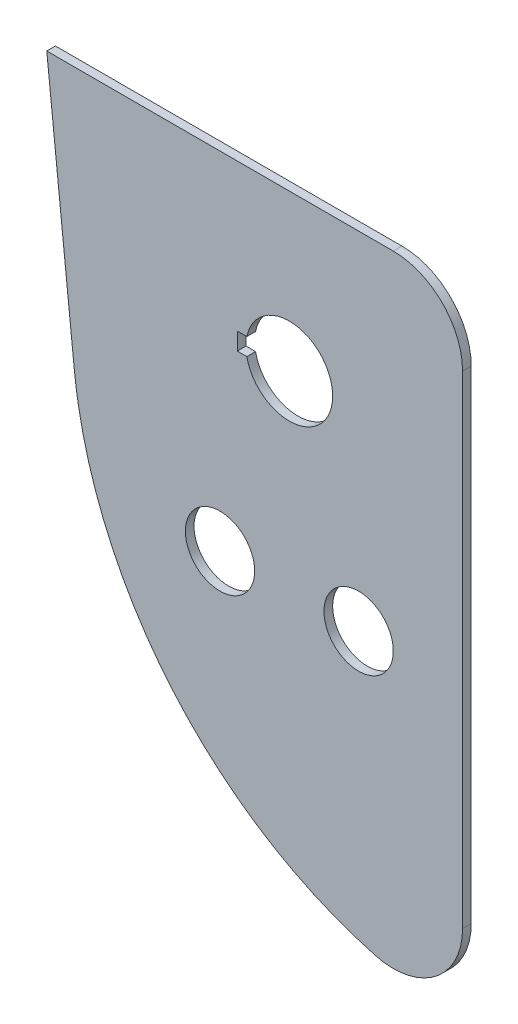
ISO-10303-21;
HEADER;
FILE_DESCRIPTION(('STEP AP214'),'2;1');
FILE_NAME('part.step','',(''),(''),'','','');
FILE_SCHEMA(('AUTOMOTIVE_DESIGN { 1 0 10303 214 1 1 1 1 }'));
ENDSEC;
DATA;
#1=APPLICATION_CONTEXT('core data for automotive mechanical design processes');
#2=APPLICATION_PROTOCOL_DEFINITION('international standard','automotive_design',2000,#1);
#3=PRODUCT_CONTEXT('',#1,'mechanical');
#4=PRODUCT('Part','Part','',(#3));
#5=PRODUCT_RELATED_PRODUCT_CATEGORY('part','',(#4));
#6=PRODUCT_DEFINITION_FORMATION('','',#4);
#7=PRODUCT_DEFINITION_CONTEXT('part definition',#1,'design');
#8=PRODUCT_DEFINITION('design','',#6,#7);
#9=PRODUCT_DEFINITION_SHAPE('','',#8);
#10=(LENGTH_UNIT() NAMED_UNIT(*) SI_UNIT(.MILLI.,.METRE.));
#11=(NAMED_UNIT(*) PLANE_ANGLE_UNIT() SI_UNIT($,.RADIAN.));
#12=(NAMED_UNIT(*) SI_UNIT($,.STERADIAN.) SOLID_ANGLE_UNIT());
#13=UNCERTAINTY_MEASURE_WITH_UNIT(LENGTH_MEASURE(1.E-05),#10,'distance_accuracy_value','');
#14=(GEOMETRIC_REPRESENTATION_CONTEXT(3) GLOBAL_UNCERTAINTY_ASSIGNED_CONTEXT((#13)) GLOBAL_UNIT_ASSIGNED_CONTEXT((#10,
#11,#12)) REPRESENTATION_CONTEXT('',''));
#15=CARTESIAN_POINT('',(0.,0.,0.));
#16=DIRECTION('',(0.,0.,1.));
#17=DIRECTION('',(1.,0.,0.));
#18=AXIS2_PLACEMENT_3D('',#15,#16,#17);
#19=CARTESIAN_POINT('',(-56.3280252004743,-154.902468876858,1.5875));
#20=CARTESIAN_POINT('',(-56.3464760441755,-154.899600353284,1.5875));
#21=CARTESIAN_POINT('',(-56.4028845170588,-154.89083061696,1.5875));
#22=CARTESIAN_POINT('',(-56.6110800326477,-154.858170111136,1.5875));
#23=CARTESIAN_POINT('',(-57.1041364240119,-154.778892219976,1.5875));
#24=CARTESIAN_POINT('',(-58.0508965766844,-154.617474355913,1.5875));
#25=CARTESIAN_POINT('',(-60.3544148529312,-154.185740423432,1.5875));
#26=CARTESIAN_POINT('',(-63.3889382662356,-153.485638356869,1.5875));
#27=CARTESIAN_POINT('',(-67.0109511921925,-152.444549796343,1.5875));
#28=CARTESIAN_POINT('',(-70.2190860634272,-151.362943175937,1.5875));
#29=CARTESIAN_POINT('',(-73.4463699671487,-150.103845865602,1.5875));
#30=CARTESIAN_POINT('',(-76.6129961365469,-148.694555997917,1.5875));
#31=CARTESIAN_POINT('',(-79.7122168788951,-147.138105291344,1.5875));
#32=CARTESIAN_POINT('',(-82.7374334194048,-145.437839357075,1.5875));
#33=CARTESIAN_POINT('',(-85.6822091427996,-143.597409415367,1.5875));
#34=CARTESIAN_POINT('',(-88.540283437849,-141.620764011248,1.5875));
#35=CARTESIAN_POINT('',(-91.3055845564438,-139.512139867612,1.5875));
#36=CARTESIAN_POINT('',(-93.9722422228184,-137.276052335977,1.5875));
#37=CARTESIAN_POINT('',(-96.5345996281736,-134.917285272487,1.5875));
#38=CARTESIAN_POINT('',(-98.9872249716935,-132.440880464169,1.5875));
#39=CARTESIAN_POINT('',(-101.324922461342,-129.852126584677,1.5875));
#40=CARTESIAN_POINT('',(-103.542742806029,-127.156547724619,1.5875));
#41=CARTESIAN_POINT('',(-105.635993174521,-124.359891507091,1.5875));
#42=CARTESIAN_POINT('',(-107.600246622216,-121.468116812763,1.5875));
#43=CARTESIAN_POINT('',(-109.431350973334,-118.487381131183,1.5875));
#44=CARTESIAN_POINT('',(-111.125437150822,-115.424027556797,1.5875));
#45=CARTESIAN_POINT('',(-112.678926942331,-112.284571447923,1.5875));
#46=CARTESIAN_POINT('',(-114.088540190762,-109.075686767198,1.5875));
#47=CARTESIAN_POINT('',(-115.351301396418,-105.804192123372,1.5875));
#48=CARTESIAN_POINT('',(-116.464545717766,-102.477036535094,1.5875));
#49=CARTESIAN_POINT('',(-117.425924356969,-99.1012849394545,1.5875));
#50=CARTESIAN_POINT('',(-118.23340931716,-95.6841034690706,1.5875));
#51=CARTESIAN_POINT('',(-118.885297518413,-92.2327445241503,1.5875));
#52=CARTESIAN_POINT('',(-119.242744402289,-89.7206525997072,1.5875));
#53=CARTESIAN_POINT('',(-119.408317308655,-88.2860300117571,1.5875));
#54=CARTESIAN_POINT('',(-119.442476963168,-87.9756583155358,1.5875));
#55=CARTESIAN_POINT('',(-119.459203349528,-87.8204331553983,1.5875));
#56=CARTESIAN_POINT('',(-119.468609127792,-87.7319314990573,1.5875));
#57=CARTESIAN_POINT('',(-119.473836088837,-87.6822365191554,1.5875));
#58=CARTESIAN_POINT('',(-119.47498022809,-87.6713586923019,1.5875));
#59=B_SPLINE_CURVE_WITH_KNOTS('',3,(#19,#20,#21,#22,#23,#24,#25,#26,#27,#28,#29,#30,#31,#32,#33,
#34,#35,#36,#37,#38,#39,#40,#41,#42,#43,#44,#45,#46,#47,#48,#49,#50,#51,#52,#53,#54,#55,#56,#57,
#58),.UNSPECIFIED.,.F.,.F.,(4,1,1,1,1,1,1,1,1,1,1,1,1,1,1,1,1,1,1,1,1,1,1,1,1,1,1,1,1,1,1,1,1,1,
1,1,1,4),(0.,0.00057063359885489,0.00174455815726337,0.0064402321787929,0.0158314421469551,
0.0310917362589596,0.0780426670362885,0.110904268377742,0.146108785012946,0.181308268021453,
0.216502218693789,0.251690199044468,0.286871835073774,0.322046819020926,0.357214910625147,
0.392375937451137,0.427529794347504,0.462676442119212,0.4978159055245,0.532948270670759,
0.568073681941952,0.603192338553654,0.6383044908169,0.673410436233386,0.70851051547869,
0.743605108360448,0.778694629809107,0.813779525945953,0.848860270263026,0.883937359954929,
0.919011312390278,0.954082661746279,0.989151955788736,0.994996677379927,0.99733455495218,
0.998503491450853,0.999672426452037,1.),.UNSPECIFIED.);
#60=DIRECTION('',(0.,0.,-1.));
#61=VECTOR('',#60,1.);
#62=SURFACE_OF_LINEAR_EXTRUSION('',#59,#61);
#63=CARTESIAN_POINT('',(-56.3280252004743,-154.902468876858,0.));
#64=CARTESIAN_POINT('',(-56.3464760441755,-154.899600353284,0.));
#65=CARTESIAN_POINT('',(-56.4028845170588,-154.89083061696,0.));
#66=CARTESIAN_POINT('',(-56.6110800326477,-154.858170111136,0.));
#67=CARTESIAN_POINT('',(-57.1041364240119,-154.778892219976,0.));
#68=CARTESIAN_POINT('',(-58.0508965766844,-154.617474355913,0.));
#69=CARTESIAN_POINT('',(-60.3544148529312,-154.185740423432,0.));
#70=CARTESIAN_POINT('',(-63.3889382662356,-153.485638356869,0.));
#71=CARTESIAN_POINT('',(-67.0109511921925,-152.444549796343,0.));
#72=CARTESIAN_POINT('',(-70.2190860634272,-151.362943175937,0.));
#73=CARTESIAN_POINT('',(-73.4463699671487,-150.103845865602,0.));
#74=CARTESIAN_POINT('',(-76.6129961365469,-148.694555997917,0.));
#75=CARTESIAN_POINT('',(-79.7122168788951,-147.138105291344,0.));
#76=CARTESIAN_POINT('',(-82.7374334194048,-145.437839357075,0.));
#77=CARTESIAN_POINT('',(-85.6822091427996,-143.597409415367,0.));
#78=CARTESIAN_POINT('',(-88.540283437849,-141.620764011248,0.));
#79=CARTESIAN_POINT('',(-91.3055845564438,-139.512139867612,0.));
#80=CARTESIAN_POINT('',(-93.9722422228184,-137.276052335977,0.));
#81=CARTESIAN_POINT('',(-96.5345996281736,-134.917285272487,0.));
#82=CARTESIAN_POINT('',(-98.9872249716935,-132.440880464169,0.));
#83=CARTESIAN_POINT('',(-101.324922461342,-129.852126584677,0.));
#84=CARTESIAN_POINT('',(-103.542742806029,-127.156547724619,0.));
#85=CARTESIAN_POINT('',(-105.635993174521,-124.359891507091,0.));
#86=CARTESIAN_POINT('',(-107.600246622216,-121.468116812763,0.));
#87=CARTESIAN_POINT('',(-109.431350973334,-118.487381131183,0.));
#88=CARTESIAN_POINT('',(-111.125437150822,-115.424027556797,0.));
#89=CARTESIAN_POINT('',(-112.678926942331,-112.284571447923,0.));
#90=CARTESIAN_POINT('',(-114.088540190762,-109.075686767198,0.));
#91=CARTESIAN_POINT('',(-115.351301396418,-105.804192123372,0.));
#92=CARTESIAN_POINT('',(-116.464545717766,-102.477036535094,0.));
#93=CARTESIAN_POINT('',(-117.425924356969,-99.1012849394545,0.));
#94=CARTESIAN_POINT('',(-118.23340931716,-95.6841034690706,0.));
#95=CARTESIAN_POINT('',(-118.885297518413,-92.2327445241503,0.));
#96=CARTESIAN_POINT('',(-119.242744402289,-89.7206525997072,0.));
#97=CARTESIAN_POINT('',(-119.408317308655,-88.2860300117571,0.));
#98=CARTESIAN_POINT('',(-119.442476963168,-87.9756583155358,0.));
#99=CARTESIAN_POINT('',(-119.459203349528,-87.8204331553983,0.));
#100=CARTESIAN_POINT('',(-119.468609127792,-87.7319314990573,0.));
#101=CARTESIAN_POINT('',(-119.473836088837,-87.6822365191554,0.));
#102=CARTESIAN_POINT('',(-119.47498022809,-87.6713586923019,0.));
#103=B_SPLINE_CURVE_WITH_KNOTS('',3,(#63,#64,#65,#66,#67,#68,#69,#70,#71,#72,#73,#74,#75,#76,
#77,#78,#79,#80,#81,#82,#83,#84,#85,#86,#87,#88,#89,#90,#91,#92,#93,#94,#95,#96,#97,#98,#99,
#100,#101,#102),.UNSPECIFIED.,.F.,.F.,(4,1,1,1,1,1,1,1,1,1,1,1,1,1,1,1,1,1,1,1,1,1,1,1,1,1,1,1,
1,1,1,1,1,1,1,1,1,4),(0.,0.00057063359885489,0.00174455815726337,0.0064402321787929,
0.0158314421469551,0.0310917362589596,0.0780426670362885,0.110904268377742,0.146108785012946,
0.181308268021453,0.216502218693789,0.251690199044468,0.286871835073774,0.322046819020926,
0.357214910625147,0.392375937451137,0.427529794347504,0.462676442119212,0.4978159055245,
0.532948270670759,0.568073681941952,0.603192338553654,0.6383044908169,0.673410436233386,
0.70851051547869,0.743605108360448,0.778694629809107,0.813779525945953,0.848860270263026,
0.883937359954929,0.919011312390278,0.954082661746279,0.989151955788736,0.994996677379927,
0.99733455495218,0.998503491450853,0.999672426452037,1.),.UNSPECIFIED.);
#104=CARTESIAN_POINT('',(-64.3348091368523,-153.199286445926,0.));
#105=VERTEX_POINT('',#104);
#106=CARTESIAN_POINT('',(-119.474980228086,-87.6713586923396,0.));
#107=VERTEX_POINT('',#106);
#108=EDGE_CURVE('E164',#105,#107,#103,.T.);
#109=ORIENTED_EDGE('',*,*,#108,.F.);
#110=DIRECTION('',(0.,0.,-1.));
#111=VECTOR('',#110,1.);
#112=CARTESIAN_POINT('',(-64.3348091368523,-153.199286445926,0.));
#113=LINE('',#112,#111);
#114=CARTESIAN_POINT('',(-64.3348091368523,-153.199286445926,1.5875));
#115=VERTEX_POINT('',#114);
#116=EDGE_CURVE('E11',#105,#115,#113,.F.);
#117=ORIENTED_EDGE('',*,*,#116,.T.);
#118=CARTESIAN_POINT('',(-119.474980228086,-87.6713586923396,1.5875));
#119=VERTEX_POINT('',#118);
#120=EDGE_CURVE('E169',#115,#119,#59,.T.);
#121=ORIENTED_EDGE('',*,*,#120,.T.);
#122=DIRECTION('',(0.,0.,-1.));
#123=VECTOR('',#122,1.);
#124=CARTESIAN_POINT('',(-119.474980228086,-87.6713586923396,1.5875));
#125=LINE('',#124,#123);
#126=EDGE_CURVE('E216',#119,#107,#125,.T.);
#127=ORIENTED_EDGE('',*,*,#126,.T.);
#128=EDGE_LOOP('',(#109,#117,#121,#127));
#129=FACE_BOUND('',#128,.T.);
#130=ADVANCED_FACE('F37',(#129),#62,.T.);
#131=CARTESIAN_POINT('',(-48.3068492831472,0.,1.5875));
#132=DIRECTION('',(-1.,0.,0.));
#133=DIRECTION('',(0.,0.,1.));
#134=AXIS2_PLACEMENT_3D('',#131,#132,#133);
#135=PLANE('',#134);
#136=DIRECTION('',(0.,1.,0.));
#137=VECTOR('',#136,1.);
#138=CARTESIAN_POINT('',(-48.3068492831472,0.,0.));
#139=LINE('',#138,#137);
#140=CARTESIAN_POINT('',(-48.3068492831472,-140.943076460285,0.));
#141=VERTEX_POINT('',#140);
#142=CARTESIAN_POINT('',(-48.3068492831472,-52.4702315071248,0.));
#143=VERTEX_POINT('',#142);
#144=EDGE_CURVE('E225',#141,#143,#139,.T.);
#145=ORIENTED_EDGE('',*,*,#144,.T.);
#146=DIRECTION('',(0.,0.,-1.));
#147=VECTOR('',#146,1.);
#148=CARTESIAN_POINT('',(-48.3068492831472,-52.4702315071248,1.5875));
#149=LINE('',#148,#147);
#150=CARTESIAN_POINT('',(-48.3068492831472,-52.4702315071248,1.5875));
#151=VERTEX_POINT('',#150);
#152=EDGE_CURVE('E58',#143,#151,#149,.F.);
#153=ORIENTED_EDGE('',*,*,#152,.T.);
#154=DIRECTION('',(0.,1.,0.));
#155=VECTOR('',#154,1.);
#156=CARTESIAN_POINT('',(-48.3068492831472,0.,1.5875));
#157=LINE('',#156,#155);
#158=CARTESIAN_POINT('',(-48.3068492831472,-140.943076460285,1.5875));
#159=VERTEX_POINT('',#158);
#160=EDGE_CURVE('E174',#159,#151,#157,.T.);
#161=ORIENTED_EDGE('',*,*,#160,.F.);
#162=DIRECTION('',(0.,0.,1.));
#163=VECTOR('',#162,1.);
#164=CARTESIAN_POINT('',(-48.3068492831472,-140.943076460285,0.));
#165=LINE('',#164,#163);
#166=EDGE_CURVE('E206',#159,#141,#165,.F.);
#167=ORIENTED_EDGE('',*,*,#166,.T.);
#168=EDGE_LOOP('',(#145,#153,#161,#167));
#169=FACE_BOUND('',#168,.T.);
#170=ADVANCED_FACE('F183',(#169),#135,.F.);
#171=CARTESIAN_POINT('',(0.,-39.7702315071249,1.5875));
#172=DIRECTION('',(0.,1.,0.));
#173=DIRECTION('',(-1.,0.,0.));
#174=AXIS2_PLACEMENT_3D('',#171,#172,#173);
#175=PLANE('',#174);
#176=DIRECTION('',(1.,0.,0.));
#177=VECTOR('',#176,1.);
#178=CARTESIAN_POINT('',(0.,-39.7702315071249,1.5875));
#179=LINE('',#178,#177);
#180=CARTESIAN_POINT('',(-124.506849283147,-39.7702315071249,1.5875));
#181=VERTEX_POINT('',#180);
#182=CARTESIAN_POINT('',(-61.0068492831472,-39.7702315071248,1.5875));
#183=VERTEX_POINT('',#182);
#184=EDGE_CURVE('E234',#181,#183,#179,.T.);
#185=ORIENTED_EDGE('',*,*,#184,.T.);
#186=DIRECTION('',(0.,0.,-1.));
#187=VECTOR('',#186,1.);
#188=CARTESIAN_POINT('',(-61.0068492831472,-39.7702315071248,0.));
#189=LINE('',#188,#187);
#190=CARTESIAN_POINT('',(-61.0068492831472,-39.7702315071248,0.));
#191=VERTEX_POINT('',#190);
#192=EDGE_CURVE('E198',#183,#191,#189,.T.);
#193=ORIENTED_EDGE('',*,*,#192,.T.);
#194=DIRECTION('',(1.,0.,0.));
#195=VECTOR('',#194,1.);
#196=CARTESIAN_POINT('',(0.,-39.7702315071249,0.));
#197=LINE('',#196,#195);
#198=CARTESIAN_POINT('',(-124.506849283147,-39.7702315071249,0.));
#199=VERTEX_POINT('',#198);
#200=EDGE_CURVE('E222',#199,#191,#197,.T.);
#201=ORIENTED_EDGE('',*,*,#200,.F.);
#202=DIRECTION('',(0.,0.,-1.));
#203=VECTOR('',#202,1.);
#204=CARTESIAN_POINT('',(-124.506849283147,-39.7702315071249,1.5875));
#205=LINE('',#204,#203);
#206=EDGE_CURVE('E214',#181,#199,#205,.T.);
#207=ORIENTED_EDGE('',*,*,#206,.F.);
#208=EDGE_LOOP('',(#185,#193,#201,#207));
#209=FACE_BOUND('',#208,.T.);
#210=ADVANCED_FACE('F247',(#209),#175,.T.);
#211=CARTESIAN_POINT('',(-127.280073271525,-13.3703881235296,1.5875));
#212=DIRECTION('',(-0.994527812563199,-0.104472149581876,0.));
#213=DIRECTION('',(0.104472149581876,-0.994527812563199,0.));
#214=AXIS2_PLACEMENT_3D('',#211,#212,#213);
#215=PLANE('',#214);
#216=DIRECTION('',(-0.104472149581876,0.9945278125632,0.));
#217=VECTOR('',#216,1.);
#218=CARTESIAN_POINT('',(-127.280073271525,-13.3703881235296,0.));
#219=LINE('',#218,#217);
#220=EDGE_CURVE('E175',#107,#199,#219,.T.);
#221=ORIENTED_EDGE('',*,*,#220,.F.);
#222=ORIENTED_EDGE('',*,*,#126,.F.);
#223=DIRECTION('',(-0.104472149581876,0.9945278125632,0.));
#224=VECTOR('',#223,1.);
#225=CARTESIAN_POINT('',(-127.280073271525,-13.3703881235296,1.5875));
#226=LINE('',#225,#224);
#227=EDGE_CURVE('E219',#119,#181,#226,.T.);
#228=ORIENTED_EDGE('',*,*,#227,.T.);
#229=ORIENTED_EDGE('',*,*,#206,.T.);
#230=EDGE_LOOP('',(#221,#222,#228,#229));
#231=FACE_BOUND('',#230,.T.);
#232=ADVANCED_FACE('F245',(#231),#215,.T.);
#233=CARTESIAN_POINT('',(0.,0.,1.5875));
#234=DIRECTION('',(0.,0.,1.));
#235=DIRECTION('',(1.,0.,0.));
#236=AXIS2_PLACEMENT_3D('',#233,#234,#235);
#237=PLANE('',#236);
#238=CARTESIAN_POINT('',(-80.0568492831472,-68.3452315071248,1.5875));
#239=DIRECTION('',(0.,0.,-1.));
#240=DIRECTION('',(-1.,0.,0.));
#241=AXIS2_PLACEMENT_3D('',#238,#239,#240);
#242=CIRCLE('',#241,7.9375);
#243=CARTESIAN_POINT('',(-87.8339792164838,-66.7577315071249,1.5875));
#244=VERTEX_POINT('',#243);
#245=CARTESIAN_POINT('',(-87.8339792164838,-69.9327315071249,1.5875));
#246=VERTEX_POINT('',#245);
#247=EDGE_CURVE('E127',#244,#246,#242,.T.);
#248=ORIENTED_EDGE('',*,*,#247,.T.);
#249=DIRECTION('',(1.,0.,0.));
#250=VECTOR('',#249,1.);
#251=CARTESIAN_POINT('',(0.,-69.9327315071249,1.5875));
#252=LINE('',#251,#250);
#253=CARTESIAN_POINT('',(-89.5818492831472,-69.9327315071249,1.5875));
#254=VERTEX_POINT('',#253);
#255=EDGE_CURVE('E115',#254,#246,#252,.T.);
#256=ORIENTED_EDGE('',*,*,#255,.F.);
#257=DIRECTION('',(0.,-1.,0.));
#258=VECTOR('',#257,1.);
#259=CARTESIAN_POINT('',(-89.5818492831472,0.,1.5875));
#260=LINE('',#259,#258);
#261=CARTESIAN_POINT('',(-89.5818492831472,-66.7577315071249,1.5875));
#262=VERTEX_POINT('',#261);
#263=EDGE_CURVE('E126',#262,#254,#260,.T.);
#264=ORIENTED_EDGE('',*,*,#263,.F.);
#265=DIRECTION('',(1.,0.,0.));
#266=VECTOR('',#265,1.);
#267=CARTESIAN_POINT('',(0.,-66.7577315071249,1.5875));
#268=LINE('',#267,#266);
#269=EDGE_CURVE('E135',#262,#244,#268,.T.);
#270=ORIENTED_EDGE('',*,*,#269,.T.);
#271=EDGE_LOOP('',(#248,#256,#264,#270));
#272=FACE_BOUND('',#271,.T.);
#273=CARTESIAN_POINT('',(-92.7568492831472,-103.270231507125,1.5875));
#274=DIRECTION('',(0.,0.,-1.));
#275=DIRECTION('',(-1.,0.,0.));
#276=AXIS2_PLACEMENT_3D('',#273,#274,#275);
#277=CIRCLE('',#276,6.34999999999999);
#278=CARTESIAN_POINT('',(-99.1068492831472,-103.270231507125,1.5875));
#279=VERTEX_POINT('',#278);
#280=EDGE_CURVE('E168',#279,#279,#277,.T.);
#281=ORIENTED_EDGE('',*,*,#280,.T.);
#282=EDGE_LOOP('',(#281));
#283=FACE_BOUND('',#282,.T.);
#284=CARTESIAN_POINT('',(-67.3568492831472,-103.270231507125,1.5875));
#285=DIRECTION('',(0.,0.,-1.));
#286=DIRECTION('',(-1.,0.,0.));
#287=AXIS2_PLACEMENT_3D('',#284,#285,#286);
#288=CIRCLE('',#287,6.34999999999999);
#289=CARTESIAN_POINT('',(-73.7068492831472,-103.270231507125,1.5875));
#290=VERTEX_POINT('',#289);
#291=EDGE_CURVE('E161',#290,#290,#288,.T.);
#292=ORIENTED_EDGE('',*,*,#291,.T.);
#293=EDGE_LOOP('',(#292));
#294=FACE_BOUND('',#293,.T.);
#295=ORIENTED_EDGE('',*,*,#160,.T.);
#296=CARTESIAN_POINT('',(-61.0068492831472,-52.4702315071248,1.5875));
#297=DIRECTION('',(0.,0.,1.));
#298=DIRECTION('',(1.,0.,0.));
#299=AXIS2_PLACEMENT_3D('',#296,#297,#298);
#300=CIRCLE('',#299,12.7);
#301=EDGE_CURVE('E45',#151,#183,#300,.T.);
#302=ORIENTED_EDGE('',*,*,#301,.T.);
#303=ORIENTED_EDGE('',*,*,#184,.F.);
#304=ORIENTED_EDGE('',*,*,#227,.F.);
#305=ORIENTED_EDGE('',*,*,#120,.F.);
#306=CARTESIAN_POINT('',(-61.0068492831472,-140.943076460285,1.5875));
#307=DIRECTION('',(0.,0.,1.));
#308=DIRECTION('',(1.,0.,0.));
#309=AXIS2_PLACEMENT_3D('',#306,#307,#308);
#310=CIRCLE('',#309,12.7);
#311=EDGE_CURVE('E202',#115,#159,#310,.T.);
#312=ORIENTED_EDGE('',*,*,#311,.T.);
#313=EDGE_LOOP('',(#295,#302,#303,#304,#305,#312));
#314=FACE_BOUND('',#313,.T.);
#315=ADVANCED_FACE('F137',(#272,#283,#294,#314),#237,.T.);
#316=CARTESIAN_POINT('',(0.,0.,0.));
#317=DIRECTION('',(0.,0.,1.));
#318=DIRECTION('',(1.,0.,0.));
#319=AXIS2_PLACEMENT_3D('',#316,#317,#318);
#320=PLANE('',#319);
#321=DIRECTION('',(1.,0.,0.));
#322=VECTOR('',#321,1.);
#323=CARTESIAN_POINT('',(0.,-69.9327315071249,0.));
#324=LINE('',#323,#322);
#325=CARTESIAN_POINT('',(-89.5818492831472,-69.9327315071249,0.));
#326=VERTEX_POINT('',#325);
#327=CARTESIAN_POINT('',(-87.8339792164838,-69.9327315071249,0.));
#328=VERTEX_POINT('',#327);
#329=EDGE_CURVE('E152',#326,#328,#324,.T.);
#330=ORIENTED_EDGE('',*,*,#329,.T.);
#331=CARTESIAN_POINT('',(-80.0568492831472,-68.3452315071248,0.));
#332=DIRECTION('',(0.,0.,-1.));
#333=DIRECTION('',(-1.,0.,0.));
#334=AXIS2_PLACEMENT_3D('',#331,#332,#333);
#335=CIRCLE('',#334,7.9375);
#336=CARTESIAN_POINT('',(-87.8339792164838,-66.7577315071249,0.));
#337=VERTEX_POINT('',#336);
#338=EDGE_CURVE('E134',#337,#328,#335,.T.);
#339=ORIENTED_EDGE('',*,*,#338,.F.);
#340=DIRECTION('',(1.,0.,0.));
#341=VECTOR('',#340,1.);
#342=CARTESIAN_POINT('',(0.,-66.7577315071249,0.));
#343=LINE('',#342,#341);
#344=CARTESIAN_POINT('',(-89.5818492831472,-66.7577315071249,0.));
#345=VERTEX_POINT('',#344);
#346=EDGE_CURVE('E140',#345,#337,#343,.T.);
#347=ORIENTED_EDGE('',*,*,#346,.F.);
#348=DIRECTION('',(0.,-1.,0.));
#349=VECTOR('',#348,1.);
#350=CARTESIAN_POINT('',(-89.5818492831472,0.,0.));
#351=LINE('',#350,#349);
#352=EDGE_CURVE('E143',#345,#326,#351,.T.);
#353=ORIENTED_EDGE('',*,*,#352,.T.);
#354=EDGE_LOOP('',(#330,#339,#347,#353));
#355=FACE_BOUND('',#354,.T.);
#356=CARTESIAN_POINT('',(-92.7568492831472,-103.270231507125,0.));
#357=DIRECTION('',(0.,0.,-1.));
#358=DIRECTION('',(-1.,0.,0.));
#359=AXIS2_PLACEMENT_3D('',#356,#357,#358);
#360=CIRCLE('',#359,6.34999999999999);
#361=CARTESIAN_POINT('',(-99.1068492831472,-103.270231507125,0.));
#362=VERTEX_POINT('',#361);
#363=EDGE_CURVE('E146',#362,#362,#360,.T.);
#364=ORIENTED_EDGE('',*,*,#363,.F.);
#365=EDGE_LOOP('',(#364));
#366=FACE_BOUND('',#365,.T.);
#367=CARTESIAN_POINT('',(-67.3568492831472,-103.270231507125,0.));
#368=DIRECTION('',(0.,0.,-1.));
#369=DIRECTION('',(-1.,0.,0.));
#370=AXIS2_PLACEMENT_3D('',#367,#368,#369);
#371=CIRCLE('',#370,6.34999999999999);
#372=CARTESIAN_POINT('',(-73.7068492831472,-103.270231507125,0.));
#373=VERTEX_POINT('',#372);
#374=EDGE_CURVE('E165',#373,#373,#371,.T.);
#375=ORIENTED_EDGE('',*,*,#374,.F.);
#376=EDGE_LOOP('',(#375));
#377=FACE_BOUND('',#376,.T.);
#378=ORIENTED_EDGE('',*,*,#200,.T.);
#379=CARTESIAN_POINT('',(-61.0068492831472,-52.4702315071248,0.));
#380=DIRECTION('',(0.,0.,1.));
#381=DIRECTION('',(1.,0.,0.));
#382=AXIS2_PLACEMENT_3D('',#379,#380,#381);
#383=CIRCLE('',#382,12.7);
#384=EDGE_CURVE('E209',#191,#143,#383,.F.);
#385=ORIENTED_EDGE('',*,*,#384,.T.);
#386=ORIENTED_EDGE('',*,*,#144,.F.);
#387=CARTESIAN_POINT('',(-61.0068492831472,-140.943076460285,0.));
#388=DIRECTION('',(0.,0.,1.));
#389=DIRECTION('',(1.,0.,0.));
#390=AXIS2_PLACEMENT_3D('',#387,#388,#389);
#391=CIRCLE('',#390,12.7);
#392=EDGE_CURVE('E211',#141,#105,#391,.F.);
#393=ORIENTED_EDGE('',*,*,#392,.T.);
#394=ORIENTED_EDGE('',*,*,#108,.T.);
#395=ORIENTED_EDGE('',*,*,#220,.T.);
#396=EDGE_LOOP('',(#378,#385,#386,#393,#394,#395));
#397=FACE_BOUND('',#396,.T.);
#398=ADVANCED_FACE('F240',(#355,#366,#377,#397),#320,.F.);
#399=CARTESIAN_POINT('',(-67.3568492831472,-103.270231507125,1.5875));
#400=DIRECTION('',(0.,0.,-1.));
#401=DIRECTION('',(-1.,0.,0.));
#402=AXIS2_PLACEMENT_3D('',#399,#400,#401);
#403=CYLINDRICAL_SURFACE('',#402,6.34999999999999);
#404=ORIENTED_EDGE('',*,*,#291,.F.);
#405=EDGE_LOOP('',(#404));
#406=FACE_BOUND('',#405,.T.);
#407=ORIENTED_EDGE('',*,*,#374,.T.);
#408=EDGE_LOOP('',(#407));
#409=FACE_BOUND('',#408,.T.);
#410=ADVANCED_FACE('F257',(#406,#409),#403,.F.);
#411=CARTESIAN_POINT('',(-92.7568492831472,-103.270231507125,1.5875));
#412=DIRECTION('',(0.,0.,-1.));
#413=DIRECTION('',(-1.,0.,0.));
#414=AXIS2_PLACEMENT_3D('',#411,#412,#413);
#415=CYLINDRICAL_SURFACE('',#414,6.34999999999999);
#416=ORIENTED_EDGE('',*,*,#280,.F.);
#417=EDGE_LOOP('',(#416));
#418=FACE_BOUND('',#417,.T.);
#419=ORIENTED_EDGE('',*,*,#363,.T.);
#420=EDGE_LOOP('',(#419));
#421=FACE_BOUND('',#420,.T.);
#422=ADVANCED_FACE('F263',(#418,#421),#415,.F.);
#423=CARTESIAN_POINT('',(-80.0568492831472,-68.3452315071248,1.5875));
#424=DIRECTION('',(0.,0.,-1.));
#425=DIRECTION('',(-1.,0.,0.));
#426=AXIS2_PLACEMENT_3D('',#423,#424,#425);
#427=CYLINDRICAL_SURFACE('',#426,7.9375);
#428=ORIENTED_EDGE('',*,*,#338,.T.);
#429=DIRECTION('',(0.,0.,-1.));
#430=VECTOR('',#429,1.);
#431=CARTESIAN_POINT('',(-87.8339792164838,-69.9327315071249,1.5875));
#432=LINE('',#431,#430);
#433=EDGE_CURVE('E119',#246,#328,#432,.T.);
#434=ORIENTED_EDGE('',*,*,#433,.F.);
#435=ORIENTED_EDGE('',*,*,#247,.F.);
#436=DIRECTION('',(0.,0.,-1.));
#437=VECTOR('',#436,1.);
#438=CARTESIAN_POINT('',(-87.8339792164838,-66.7577315071249,1.5875));
#439=LINE('',#438,#437);
#440=EDGE_CURVE('E156',#244,#337,#439,.T.);
#441=ORIENTED_EDGE('',*,*,#440,.T.);
#442=EDGE_LOOP('',(#428,#434,#435,#441));
#443=FACE_BOUND('',#442,.T.);
#444=ADVANCED_FACE('F131',(#443),#427,.F.);
#445=CARTESIAN_POINT('',(0.,-66.7577315071249,1.5875));
#446=DIRECTION('',(0.,1.,0.));
#447=DIRECTION('',(0.,0.,1.));
#448=AXIS2_PLACEMENT_3D('',#445,#446,#447);
#449=PLANE('',#448);
#450=ORIENTED_EDGE('',*,*,#346,.T.);
#451=ORIENTED_EDGE('',*,*,#440,.F.);
#452=ORIENTED_EDGE('',*,*,#269,.F.);
#453=DIRECTION('',(0.,0.,-1.));
#454=VECTOR('',#453,1.);
#455=CARTESIAN_POINT('',(-89.5818492831472,-66.7577315071249,1.5875));
#456=LINE('',#455,#454);
#457=EDGE_CURVE('E158',#262,#345,#456,.T.);
#458=ORIENTED_EDGE('',*,*,#457,.T.);
#459=EDGE_LOOP('',(#450,#451,#452,#458));
#460=FACE_BOUND('',#459,.T.);
#461=ADVANCED_FACE('F266',(#460),#449,.F.);
#462=CARTESIAN_POINT('',(-89.5818492831472,0.,1.5875));
#463=DIRECTION('',(1.,0.,0.));
#464=DIRECTION('',(0.,0.,-1.));
#465=AXIS2_PLACEMENT_3D('',#462,#463,#464);
#466=PLANE('',#465);
#467=ORIENTED_EDGE('',*,*,#352,.F.);
#468=ORIENTED_EDGE('',*,*,#457,.F.);
#469=ORIENTED_EDGE('',*,*,#263,.T.);
#470=DIRECTION('',(0.,0.,-1.));
#471=VECTOR('',#470,1.);
#472=CARTESIAN_POINT('',(-89.5818492831472,-69.9327315071249,1.5875));
#473=LINE('',#472,#471);
#474=EDGE_CURVE('E121',#254,#326,#473,.T.);
#475=ORIENTED_EDGE('',*,*,#474,.T.);
#476=EDGE_LOOP('',(#467,#468,#469,#475));
#477=FACE_BOUND('',#476,.T.);
#478=ADVANCED_FACE('F193',(#477),#466,.T.);
#479=CARTESIAN_POINT('',(0.,-69.9327315071249,1.5875));
#480=DIRECTION('',(0.,1.,0.));
#481=DIRECTION('',(0.,0.,1.));
#482=AXIS2_PLACEMENT_3D('',#479,#480,#481);
#483=PLANE('',#482);
#484=ORIENTED_EDGE('',*,*,#329,.F.);
#485=ORIENTED_EDGE('',*,*,#474,.F.);
#486=ORIENTED_EDGE('',*,*,#255,.T.);
#487=ORIENTED_EDGE('',*,*,#433,.T.);
#488=EDGE_LOOP('',(#484,#485,#486,#487));
#489=FACE_BOUND('',#488,.T.);
#490=ADVANCED_FACE('F118',(#489),#483,.T.);
#491=CARTESIAN_POINT('',(-61.0068492831472,-52.4702315071248,1.5875));
#492=DIRECTION('',(0.,0.,1.));
#493=DIRECTION('',(1.,0.,0.));
#494=AXIS2_PLACEMENT_3D('',#491,#492,#493);
#495=CYLINDRICAL_SURFACE('',#494,12.7);
#496=ORIENTED_EDGE('',*,*,#301,.F.);
#497=ORIENTED_EDGE('',*,*,#152,.F.);
#498=ORIENTED_EDGE('',*,*,#384,.F.);
#499=ORIENTED_EDGE('',*,*,#192,.F.);
#500=EDGE_LOOP('',(#496,#497,#498,#499));
#501=FACE_BOUND('',#500,.T.);
#502=ADVANCED_FACE('F185',(#501),#495,.T.);
#503=CARTESIAN_POINT('',(-61.0068492831472,-140.943076460285,0.79375));
#504=DIRECTION('',(0.,0.,-1.));
#505=DIRECTION('',(-1.,0.,0.));
#506=AXIS2_PLACEMENT_3D('',#503,#504,#505);
#507=CYLINDRICAL_SURFACE('',#506,12.7);
#508=ORIENTED_EDGE('',*,*,#311,.F.);
#509=ORIENTED_EDGE('',*,*,#116,.F.);
#510=ORIENTED_EDGE('',*,*,#392,.F.);
#511=ORIENTED_EDGE('',*,*,#166,.F.);
#512=EDGE_LOOP('',(#508,#509,#510,#511));
#513=FACE_BOUND('',#512,.T.);
#514=ADVANCED_FACE('F39',(#513),#507,.T.);
#515=CLOSED_SHELL('',(#130,#170,#210,#232,#315,#398,#410,#422,#444,#461,#478,#490,#502,#514));
#516=MANIFOLD_SOLID_BREP('B2',#515);
#517=ADVANCED_BREP_SHAPE_REPRESENTATION('',(#18,#516),#14);
#518=SHAPE_DEFINITION_REPRESENTATION(#9,#517);
ENDSEC;
END-ISO-10303-21;
